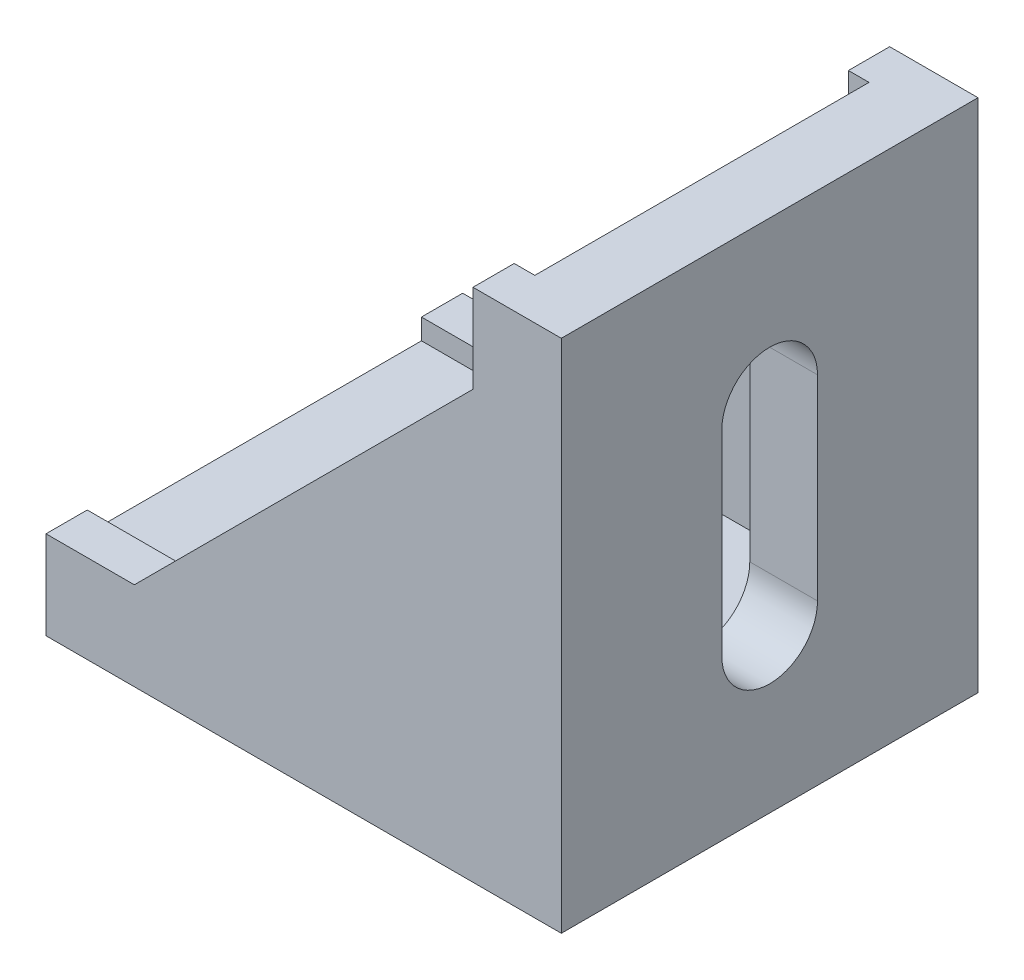
ISO-10303-21;
HEADER;
FILE_DESCRIPTION(('STEP AP214'),'2;1');
FILE_NAME('part.step','',(''),(''),'','','');
FILE_SCHEMA(('AUTOMOTIVE_DESIGN { 1 0 10303 214 1 1 1 1 }'));
ENDSEC;
DATA;
#1=APPLICATION_CONTEXT('core data for automotive mechanical design processes');
#2=APPLICATION_PROTOCOL_DEFINITION('international standard','automotive_design',2000,#1);
#3=PRODUCT_CONTEXT('',#1,'mechanical');
#4=PRODUCT('Part','Part','',(#3));
#5=PRODUCT_RELATED_PRODUCT_CATEGORY('part','',(#4));
#6=PRODUCT_DEFINITION_FORMATION('','',#4);
#7=PRODUCT_DEFINITION_CONTEXT('part definition',#1,'design');
#8=PRODUCT_DEFINITION('design','',#6,#7);
#9=PRODUCT_DEFINITION_SHAPE('','',#8);
#10=(LENGTH_UNIT() NAMED_UNIT(*) SI_UNIT(.MILLI.,.METRE.));
#11=(NAMED_UNIT(*) PLANE_ANGLE_UNIT() SI_UNIT($,.RADIAN.));
#12=(NAMED_UNIT(*) SI_UNIT($,.STERADIAN.) SOLID_ANGLE_UNIT());
#13=UNCERTAINTY_MEASURE_WITH_UNIT(LENGTH_MEASURE(1.E-05),#10,'distance_accuracy_value','');
#14=(GEOMETRIC_REPRESENTATION_CONTEXT(3) GLOBAL_UNCERTAINTY_ASSIGNED_CONTEXT((#13)) GLOBAL_UNIT_ASSIGNED_CONTEXT((#10,
#11,#12)) REPRESENTATION_CONTEXT('',''));
#15=CARTESIAN_POINT('',(0.,0.,0.));
#16=DIRECTION('',(0.,0.,1.));
#17=DIRECTION('',(1.,0.,0.));
#18=AXIS2_PLACEMENT_3D('',#15,#16,#17);
#19=CARTESIAN_POINT('',(35.,0.,14.15));
#20=DIRECTION('',(-1.,0.,0.));
#21=DIRECTION('',(0.,0.,1.));
#22=AXIS2_PLACEMENT_3D('',#19,#20,#21);
#23=PLANE('',#22);
#24=DIRECTION('',(0.,1.,0.));
#25=VECTOR('',#24,1.);
#26=CARTESIAN_POINT('',(35.,0.,-14.15));
#27=LINE('',#26,#25);
#28=CARTESIAN_POINT('',(35.,0.,-14.15));
#29=VERTEX_POINT('',#28);
#30=CARTESIAN_POINT('',(35.,35.,-14.15));
#31=VERTEX_POINT('',#30);
#32=EDGE_CURVE('E311',#29,#31,#27,.T.);
#33=ORIENTED_EDGE('',*,*,#32,.T.);
#34=DIRECTION('',(0.,0.,-1.));
#35=VECTOR('',#34,1.);
#36=CARTESIAN_POINT('',(35.,35.,14.15));
#37=LINE('',#36,#35);
#38=CARTESIAN_POINT('',(35.,35.,14.15));
#39=VERTEX_POINT('',#38);
#40=EDGE_CURVE('E339',#39,#31,#37,.T.);
#41=ORIENTED_EDGE('',*,*,#40,.F.);
#42=DIRECTION('',(0.,1.,0.));
#43=VECTOR('',#42,1.);
#44=CARTESIAN_POINT('',(35.,0.,14.15));
#45=LINE('',#44,#43);
#46=CARTESIAN_POINT('',(35.,0.,14.15));
#47=VERTEX_POINT('',#46);
#48=EDGE_CURVE('E296',#47,#39,#45,.T.);
#49=ORIENTED_EDGE('',*,*,#48,.F.);
#50=DIRECTION('',(0.,0.,-1.));
#51=VECTOR('',#50,1.);
#52=CARTESIAN_POINT('',(35.,0.,14.15));
#53=LINE('',#52,#51);
#54=EDGE_CURVE('E342',#47,#29,#53,.T.);
#55=ORIENTED_EDGE('',*,*,#54,.T.);
#56=EDGE_LOOP('',(#33,#41,#49,#55));
#57=FACE_BOUND('',#56,.T.);
#58=CARTESIAN_POINT('',(35.,10.85,0.));
#59=DIRECTION('',(-1.,0.,0.));
#60=DIRECTION('',(0.,0.,1.));
#61=AXIS2_PLACEMENT_3D('',#58,#59,#60);
#62=CIRCLE('',#61,3.25);
#63=CARTESIAN_POINT('',(35.,10.85,-3.25));
#64=VERTEX_POINT('',#63);
#65=CARTESIAN_POINT('',(35.,10.85,3.25));
#66=VERTEX_POINT('',#65);
#67=EDGE_CURVE('E213',#64,#66,#62,.T.);
#68=ORIENTED_EDGE('',*,*,#67,.T.);
#69=DIRECTION('',(0.,1.,0.));
#70=VECTOR('',#69,1.);
#71=CARTESIAN_POINT('',(35.,10.85,3.25));
#72=LINE('',#71,#70);
#73=CARTESIAN_POINT('',(35.,24.15,3.25));
#74=VERTEX_POINT('',#73);
#75=EDGE_CURVE('E199',#66,#74,#72,.T.);
#76=ORIENTED_EDGE('',*,*,#75,.T.);
#77=CARTESIAN_POINT('',(35.,24.15,0.));
#78=DIRECTION('',(-1.,0.,0.));
#79=DIRECTION('',(0.,0.,1.));
#80=AXIS2_PLACEMENT_3D('',#77,#78,#79);
#81=CIRCLE('',#80,3.25);
#82=CARTESIAN_POINT('',(35.,24.15,-3.25));
#83=VERTEX_POINT('',#82);
#84=EDGE_CURVE('E190',#74,#83,#81,.T.);
#85=ORIENTED_EDGE('',*,*,#84,.T.);
#86=DIRECTION('',(0.,-1.,0.));
#87=VECTOR('',#86,1.);
#88=CARTESIAN_POINT('',(35.,10.85,-3.25));
#89=LINE('',#88,#87);
#90=EDGE_CURVE('E210',#83,#64,#89,.T.);
#91=ORIENTED_EDGE('',*,*,#90,.T.);
#92=EDGE_LOOP('',(#68,#76,#85,#91));
#93=FACE_BOUND('',#92,.T.);
#94=ADVANCED_FACE('F35',(#57,#93),#23,.F.);
#95=CARTESIAN_POINT('',(30.4,4.59999999999999,11.35));
#96=DIRECTION('',(-1.,0.,0.));
#97=DIRECTION('',(0.,0.,1.));
#98=AXIS2_PLACEMENT_3D('',#95,#96,#97);
#99=PLANE('',#98);
#100=DIRECTION('',(0.,1.,0.));
#101=VECTOR('',#100,1.);
#102=CARTESIAN_POINT('',(30.4,4.59999999999999,-11.35));
#103=LINE('',#102,#101);
#104=CARTESIAN_POINT('',(30.4,4.59999999999999,-11.35));
#105=VERTEX_POINT('',#104);
#106=CARTESIAN_POINT('',(30.4,35.,-11.35));
#107=VERTEX_POINT('',#106);
#108=EDGE_CURVE('E268',#105,#107,#103,.T.);
#109=ORIENTED_EDGE('',*,*,#108,.F.);
#110=DIRECTION('',(0.,0.,-1.));
#111=VECTOR('',#110,1.);
#112=CARTESIAN_POINT('',(30.4,4.59999999999999,11.35));
#113=LINE('',#112,#111);
#114=CARTESIAN_POINT('',(30.4,4.59999999999999,11.35));
#115=VERTEX_POINT('',#114);
#116=EDGE_CURVE('E273',#115,#105,#113,.T.);
#117=ORIENTED_EDGE('',*,*,#116,.F.);
#118=DIRECTION('',(0.,1.,0.));
#119=VECTOR('',#118,1.);
#120=CARTESIAN_POINT('',(30.4,4.59999999999999,11.35));
#121=LINE('',#120,#119);
#122=CARTESIAN_POINT('',(30.4,35.,11.35));
#123=VERTEX_POINT('',#122);
#124=EDGE_CURVE('E259',#115,#123,#121,.T.);
#125=ORIENTED_EDGE('',*,*,#124,.T.);
#126=DIRECTION('',(0.,0.,-1.));
#127=VECTOR('',#126,1.);
#128=CARTESIAN_POINT('',(30.4,35.,11.35));
#129=LINE('',#128,#127);
#130=EDGE_CURVE('E264',#123,#107,#129,.T.);
#131=ORIENTED_EDGE('',*,*,#130,.T.);
#132=EDGE_LOOP('',(#109,#117,#125,#131));
#133=FACE_BOUND('',#132,.T.);
#134=DIRECTION('',(0.,1.,0.));
#135=VECTOR('',#134,1.);
#136=CARTESIAN_POINT('',(30.4,10.85,3.25));
#137=LINE('',#136,#135);
#138=CARTESIAN_POINT('',(30.4,10.85,3.25));
#139=VERTEX_POINT('',#138);
#140=CARTESIAN_POINT('',(30.4,24.15,3.25));
#141=VERTEX_POINT('',#140);
#142=EDGE_CURVE('E196',#139,#141,#137,.T.);
#143=ORIENTED_EDGE('',*,*,#142,.F.);
#144=CARTESIAN_POINT('',(30.4,10.85,0.));
#145=DIRECTION('',(-1.,0.,0.));
#146=DIRECTION('',(0.,0.,1.));
#147=AXIS2_PLACEMENT_3D('',#144,#145,#146);
#148=CIRCLE('',#147,3.25);
#149=CARTESIAN_POINT('',(30.4,10.85,-3.25));
#150=VERTEX_POINT('',#149);
#151=EDGE_CURVE('E58',#150,#139,#148,.T.);
#152=ORIENTED_EDGE('',*,*,#151,.F.);
#153=DIRECTION('',(0.,-1.,0.));
#154=VECTOR('',#153,1.);
#155=CARTESIAN_POINT('',(30.4,10.85,-3.25));
#156=LINE('',#155,#154);
#157=CARTESIAN_POINT('',(30.4,24.15,-3.25));
#158=VERTEX_POINT('',#157);
#159=EDGE_CURVE('E204',#158,#150,#156,.T.);
#160=ORIENTED_EDGE('',*,*,#159,.F.);
#161=CARTESIAN_POINT('',(30.4,24.15,0.));
#162=DIRECTION('',(-1.,0.,0.));
#163=DIRECTION('',(0.,0.,1.));
#164=AXIS2_PLACEMENT_3D('',#161,#162,#163);
#165=CIRCLE('',#164,3.25);
#166=EDGE_CURVE('E187',#141,#158,#165,.T.);
#167=ORIENTED_EDGE('',*,*,#166,.F.);
#168=EDGE_LOOP('',(#143,#152,#160,#167));
#169=FACE_BOUND('',#168,.T.);
#170=ADVANCED_FACE('F202',(#133,#169),#99,.T.);
#171=CARTESIAN_POINT('',(0.,0.,14.15));
#172=DIRECTION('',(0.,1.,0.));
#173=DIRECTION('',(0.,0.,1.));
#174=AXIS2_PLACEMENT_3D('',#171,#172,#173);
#175=PLANE('',#174);
#176=DIRECTION('',(1.,0.,0.));
#177=VECTOR('',#176,1.);
#178=CARTESIAN_POINT('',(0.,0.,-14.15));
#179=LINE('',#178,#177);
#180=CARTESIAN_POINT('',(0.,0.,-14.15));
#181=VERTEX_POINT('',#180);
#182=EDGE_CURVE('E309',#181,#29,#179,.T.);
#183=ORIENTED_EDGE('',*,*,#182,.T.);
#184=ORIENTED_EDGE('',*,*,#54,.F.);
#185=DIRECTION('',(1.,0.,0.));
#186=VECTOR('',#185,1.);
#187=CARTESIAN_POINT('',(0.,0.,14.15));
#188=LINE('',#187,#186);
#189=CARTESIAN_POINT('',(0.,0.,14.15));
#190=VERTEX_POINT('',#189);
#191=EDGE_CURVE('E293',#190,#47,#188,.T.);
#192=ORIENTED_EDGE('',*,*,#191,.F.);
#193=DIRECTION('',(0.,0.,-1.));
#194=VECTOR('',#193,1.);
#195=CARTESIAN_POINT('',(0.,0.,14.15));
#196=LINE('',#195,#194);
#197=EDGE_CURVE('E345',#190,#181,#196,.T.);
#198=ORIENTED_EDGE('',*,*,#197,.T.);
#199=EDGE_LOOP('',(#183,#184,#192,#198));
#200=FACE_BOUND('',#199,.T.);
#201=CARTESIAN_POINT('',(10.85,0.,0.));
#202=DIRECTION('',(0.,1.,0.));
#203=DIRECTION('',(0.,0.,1.));
#204=AXIS2_PLACEMENT_3D('',#201,#202,#203);
#205=CIRCLE('',#204,3.25);
#206=CARTESIAN_POINT('',(10.85,0.,-3.25));
#207=VERTEX_POINT('',#206);
#208=CARTESIAN_POINT('',(10.85,0.,3.25));
#209=VERTEX_POINT('',#208);
#210=EDGE_CURVE('E228',#207,#209,#205,.T.);
#211=ORIENTED_EDGE('',*,*,#210,.T.);
#212=DIRECTION('',(1.,0.,0.));
#213=VECTOR('',#212,1.);
#214=CARTESIAN_POINT('',(10.85,0.,3.25));
#215=LINE('',#214,#213);
#216=CARTESIAN_POINT('',(24.15,0.,3.25));
#217=VERTEX_POINT('',#216);
#218=EDGE_CURVE('E231',#209,#217,#215,.T.);
#219=ORIENTED_EDGE('',*,*,#218,.T.);
#220=CARTESIAN_POINT('',(24.15,0.,0.));
#221=DIRECTION('',(0.,1.,0.));
#222=DIRECTION('',(0.,0.,1.));
#223=AXIS2_PLACEMENT_3D('',#220,#221,#222);
#224=CIRCLE('',#223,3.25);
#225=CARTESIAN_POINT('',(24.15,0.,-3.25));
#226=VERTEX_POINT('',#225);
#227=EDGE_CURVE('E234',#217,#226,#224,.T.);
#228=ORIENTED_EDGE('',*,*,#227,.T.);
#229=DIRECTION('',(-1.,0.,0.));
#230=VECTOR('',#229,1.);
#231=CARTESIAN_POINT('',(10.85,0.,-3.25));
#232=LINE('',#231,#230);
#233=EDGE_CURVE('E237',#226,#207,#232,.T.);
#234=ORIENTED_EDGE('',*,*,#233,.T.);
#235=EDGE_LOOP('',(#211,#219,#228,#234));
#236=FACE_BOUND('',#235,.T.);
#237=ADVANCED_FACE('F368',(#200,#236),#175,.F.);
#238=CARTESIAN_POINT('',(0.,4.59999999999999,11.35));
#239=DIRECTION('',(0.,1.,0.));
#240=DIRECTION('',(0.,0.,1.));
#241=AXIS2_PLACEMENT_3D('',#238,#239,#240);
#242=PLANE('',#241);
#243=DIRECTION('',(1.,0.,0.));
#244=VECTOR('',#243,1.);
#245=CARTESIAN_POINT('',(0.,4.59999999999999,-11.35));
#246=LINE('',#245,#244);
#247=CARTESIAN_POINT('',(0.,4.59999999999999,-11.35));
#248=VERTEX_POINT('',#247);
#249=EDGE_CURVE('E266',#248,#105,#246,.T.);
#250=ORIENTED_EDGE('',*,*,#249,.F.);
#251=DIRECTION('',(0.,0.,-1.));
#252=VECTOR('',#251,1.);
#253=CARTESIAN_POINT('',(0.,4.59999999999999,11.35));
#254=LINE('',#253,#252);
#255=CARTESIAN_POINT('',(0.,4.59999999999999,11.35));
#256=VERTEX_POINT('',#255);
#257=EDGE_CURVE('E276',#256,#248,#254,.T.);
#258=ORIENTED_EDGE('',*,*,#257,.F.);
#259=DIRECTION('',(1.,0.,0.));
#260=VECTOR('',#259,1.);
#261=CARTESIAN_POINT('',(0.,4.59999999999999,11.35));
#262=LINE('',#261,#260);
#263=EDGE_CURVE('E256',#256,#115,#262,.T.);
#264=ORIENTED_EDGE('',*,*,#263,.T.);
#265=ORIENTED_EDGE('',*,*,#116,.T.);
#266=EDGE_LOOP('',(#250,#258,#264,#265));
#267=FACE_BOUND('',#266,.T.);
#268=DIRECTION('',(1.,0.,0.));
#269=VECTOR('',#268,1.);
#270=CARTESIAN_POINT('',(10.85,4.59999999999999,3.25));
#271=LINE('',#270,#269);
#272=CARTESIAN_POINT('',(10.85,4.59999999999999,3.25));
#273=VERTEX_POINT('',#272);
#274=CARTESIAN_POINT('',(24.15,4.59999999999999,3.25));
#275=VERTEX_POINT('',#274);
#276=EDGE_CURVE('E222',#273,#275,#271,.T.);
#277=ORIENTED_EDGE('',*,*,#276,.F.);
#278=CARTESIAN_POINT('',(10.85,4.59999999999999,0.));
#279=DIRECTION('',(0.,1.,0.));
#280=DIRECTION('',(0.,0.,1.));
#281=AXIS2_PLACEMENT_3D('',#278,#279,#280);
#282=CIRCLE('',#281,3.25);
#283=CARTESIAN_POINT('',(10.85,4.59999999999999,-3.25));
#284=VERTEX_POINT('',#283);
#285=EDGE_CURVE('E225',#284,#273,#282,.T.);
#286=ORIENTED_EDGE('',*,*,#285,.F.);
#287=DIRECTION('',(-1.,0.,0.));
#288=VECTOR('',#287,1.);
#289=CARTESIAN_POINT('',(10.85,4.59999999999999,-3.25));
#290=LINE('',#289,#288);
#291=CARTESIAN_POINT('',(24.15,4.59999999999999,-3.25));
#292=VERTEX_POINT('',#291);
#293=EDGE_CURVE('E249',#292,#284,#290,.T.);
#294=ORIENTED_EDGE('',*,*,#293,.F.);
#295=CARTESIAN_POINT('',(24.15,4.59999999999999,0.));
#296=DIRECTION('',(0.,1.,0.));
#297=DIRECTION('',(0.,0.,1.));
#298=AXIS2_PLACEMENT_3D('',#295,#296,#297);
#299=CIRCLE('',#298,3.25);
#300=EDGE_CURVE('E220',#275,#292,#299,.T.);
#301=ORIENTED_EDGE('',*,*,#300,.F.);
#302=EDGE_LOOP('',(#277,#286,#294,#301));
#303=FACE_BOUND('',#302,.T.);
#304=ADVANCED_FACE('F386',(#267,#303),#242,.T.);
#305=CARTESIAN_POINT('',(29.,35.,14.15));
#306=DIRECTION('',(1.,0.,0.));
#307=DIRECTION('',(0.,0.,-1.));
#308=AXIS2_PLACEMENT_3D('',#305,#306,#307);
#309=PLANE('',#308);
#310=DIRECTION('',(0.,-1.,0.));
#311=VECTOR('',#310,1.);
#312=CARTESIAN_POINT('',(29.,35.,-11.35));
#313=LINE('',#312,#311);
#314=CARTESIAN_POINT('',(29.,35.,-11.35));
#315=VERTEX_POINT('',#314);
#316=CARTESIAN_POINT('',(29.,29.,-11.35));
#317=VERTEX_POINT('',#316);
#318=EDGE_CURVE('E281',#315,#317,#313,.T.);
#319=ORIENTED_EDGE('',*,*,#318,.F.);
#320=DIRECTION('',(0.,0.,-1.));
#321=VECTOR('',#320,1.);
#322=CARTESIAN_POINT('',(29.,35.,14.15));
#323=LINE('',#322,#321);
#324=CARTESIAN_POINT('',(29.,35.,-14.15));
#325=VERTEX_POINT('',#324);
#326=EDGE_CURVE('E335',#315,#325,#323,.T.);
#327=ORIENTED_EDGE('',*,*,#326,.T.);
#328=DIRECTION('',(0.,-1.,0.));
#329=VECTOR('',#328,1.);
#330=CARTESIAN_POINT('',(29.,35.,-14.15));
#331=LINE('',#330,#329);
#332=CARTESIAN_POINT('',(29.,29.,-14.15));
#333=VERTEX_POINT('',#332);
#334=EDGE_CURVE('E316',#325,#333,#331,.T.);
#335=ORIENTED_EDGE('',*,*,#334,.T.);
#336=DIRECTION('',(0.,0.,-1.));
#337=VECTOR('',#336,1.);
#338=CARTESIAN_POINT('',(29.,29.,14.15));
#339=LINE('',#338,#337);
#340=EDGE_CURVE('E331',#317,#333,#339,.T.);
#341=ORIENTED_EDGE('',*,*,#340,.F.);
#342=EDGE_LOOP('',(#319,#327,#335,#341));
#343=FACE_BOUND('',#342,.T.);
#344=ADVANCED_FACE('F399',(#343),#309,.F.);
#345=CARTESIAN_POINT('',(29.,29.,14.15));
#346=DIRECTION('',(0.707106781186547,-0.707106781186547,0.));
#347=DIRECTION('',(0.707106781186548,0.707106781186548,0.));
#348=AXIS2_PLACEMENT_3D('',#345,#346,#347);
#349=PLANE('',#348);
#350=DIRECTION('',(-0.707106781186548,-0.707106781186548,0.));
#351=VECTOR('',#350,1.);
#352=CARTESIAN_POINT('',(29.,29.,-11.35));
#353=LINE('',#352,#351);
#354=CARTESIAN_POINT('',(6.,6.,-11.35));
#355=VERTEX_POINT('',#354);
#356=EDGE_CURVE('E279',#317,#355,#353,.T.);
#357=ORIENTED_EDGE('',*,*,#356,.F.);
#358=ORIENTED_EDGE('',*,*,#340,.T.);
#359=DIRECTION('',(-0.707106781186548,-0.707106781186548,0.));
#360=VECTOR('',#359,1.);
#361=CARTESIAN_POINT('',(29.,29.,-14.15));
#362=LINE('',#361,#360);
#363=CARTESIAN_POINT('',(6.,6.,-14.15));
#364=VERTEX_POINT('',#363);
#365=EDGE_CURVE('E319',#333,#364,#362,.T.);
#366=ORIENTED_EDGE('',*,*,#365,.T.);
#367=DIRECTION('',(0.,0.,-1.));
#368=VECTOR('',#367,1.);
#369=CARTESIAN_POINT('',(6.,6.,14.15));
#370=LINE('',#369,#368);
#371=EDGE_CURVE('E327',#355,#364,#370,.T.);
#372=ORIENTED_EDGE('',*,*,#371,.F.);
#373=EDGE_LOOP('',(#357,#358,#366,#372));
#374=FACE_BOUND('',#373,.T.);
#375=ADVANCED_FACE('F402',(#374),#349,.F.);
#376=CARTESIAN_POINT('',(6.,6.,14.15));
#377=DIRECTION('',(0.,-1.,0.));
#378=DIRECTION('',(1.,0.,0.));
#379=AXIS2_PLACEMENT_3D('',#376,#377,#378);
#380=PLANE('',#379);
#381=DIRECTION('',(-1.,0.,0.));
#382=VECTOR('',#381,1.);
#383=CARTESIAN_POINT('',(6.,6.,-11.35));
#384=LINE('',#383,#382);
#385=CARTESIAN_POINT('',(0.,6.,-11.35));
#386=VERTEX_POINT('',#385);
#387=EDGE_CURVE('E43',#355,#386,#384,.T.);
#388=ORIENTED_EDGE('',*,*,#387,.F.);
#389=ORIENTED_EDGE('',*,*,#371,.T.);
#390=DIRECTION('',(-1.,0.,0.));
#391=VECTOR('',#390,1.);
#392=CARTESIAN_POINT('',(6.,6.,-14.15));
#393=LINE('',#392,#391);
#394=CARTESIAN_POINT('',(0.,6.,-14.15));
#395=VERTEX_POINT('',#394);
#396=EDGE_CURVE('E294',#364,#395,#393,.T.);
#397=ORIENTED_EDGE('',*,*,#396,.T.);
#398=DIRECTION('',(0.,0.,-1.));
#399=VECTOR('',#398,1.);
#400=CARTESIAN_POINT('',(0.,6.,14.15));
#401=LINE('',#400,#399);
#402=EDGE_CURVE('E306',#386,#395,#401,.T.);
#403=ORIENTED_EDGE('',*,*,#402,.F.);
#404=EDGE_LOOP('',(#388,#389,#397,#403));
#405=FACE_BOUND('',#404,.T.);
#406=ADVANCED_FACE('F358',(#405),#380,.F.);
#407=CARTESIAN_POINT('',(0.,6.,14.15));
#408=DIRECTION('',(1.,0.,0.));
#409=DIRECTION('',(0.,1.,0.));
#410=AXIS2_PLACEMENT_3D('',#407,#408,#409);
#411=PLANE('',#410);
#412=CARTESIAN_POINT('',(0.,6.,14.15));
#413=VERTEX_POINT('',#412);
#414=CARTESIAN_POINT('',(0.,6.,11.35));
#415=VERTEX_POINT('',#414);
#416=EDGE_CURVE('E324',#413,#415,#401,.T.);
#417=ORIENTED_EDGE('',*,*,#416,.T.);
#418=DIRECTION('',(0.,-1.,0.));
#419=VECTOR('',#418,1.);
#420=CARTESIAN_POINT('',(0.,35.,11.35));
#421=LINE('',#420,#419);
#422=EDGE_CURVE('E253',#415,#256,#421,.T.);
#423=ORIENTED_EDGE('',*,*,#422,.T.);
#424=ORIENTED_EDGE('',*,*,#257,.T.);
#425=DIRECTION('',(0.,-1.,0.));
#426=VECTOR('',#425,1.);
#427=CARTESIAN_POINT('',(0.,35.,-11.35));
#428=LINE('',#427,#426);
#429=EDGE_CURVE('E252',#386,#248,#428,.T.);
#430=ORIENTED_EDGE('',*,*,#429,.F.);
#431=ORIENTED_EDGE('',*,*,#402,.T.);
#432=DIRECTION('',(0.,-1.,0.));
#433=VECTOR('',#432,1.);
#434=CARTESIAN_POINT('',(0.,6.,-14.15));
#435=LINE('',#434,#433);
#436=EDGE_CURVE('E289',#395,#181,#435,.T.);
#437=ORIENTED_EDGE('',*,*,#436,.T.);
#438=ORIENTED_EDGE('',*,*,#197,.F.);
#439=DIRECTION('',(0.,-1.,0.));
#440=VECTOR('',#439,1.);
#441=CARTESIAN_POINT('',(0.,6.,14.15));
#442=LINE('',#441,#440);
#443=EDGE_CURVE('E290',#413,#190,#442,.T.);
#444=ORIENTED_EDGE('',*,*,#443,.F.);
#445=EDGE_LOOP('',(#417,#423,#424,#430,#431,#437,#438,#444));
#446=FACE_BOUND('',#445,.T.);
#447=ADVANCED_FACE('F37',(#446),#411,.F.);
#448=CARTESIAN_POINT('',(35.,35.,14.15));
#449=DIRECTION('',(0.,-1.,0.));
#450=DIRECTION('',(0.,0.,-1.));
#451=AXIS2_PLACEMENT_3D('',#448,#449,#450);
#452=PLANE('',#451);
#453=ORIENTED_EDGE('',*,*,#130,.F.);
#454=DIRECTION('',(-1.,0.,0.));
#455=VECTOR('',#454,1.);
#456=CARTESIAN_POINT('',(30.4,35.,11.35));
#457=LINE('',#456,#455);
#458=CARTESIAN_POINT('',(29.,35.,11.35));
#459=VERTEX_POINT('',#458);
#460=EDGE_CURVE('E261',#123,#459,#457,.T.);
#461=ORIENTED_EDGE('',*,*,#460,.T.);
#462=CARTESIAN_POINT('',(29.,35.,14.15));
#463=VERTEX_POINT('',#462);
#464=EDGE_CURVE('E336',#463,#459,#323,.T.);
#465=ORIENTED_EDGE('',*,*,#464,.F.);
#466=DIRECTION('',(-1.,0.,0.));
#467=VECTOR('',#466,1.);
#468=CARTESIAN_POINT('',(35.,35.,14.15));
#469=LINE('',#468,#467);
#470=EDGE_CURVE('E298',#39,#463,#469,.T.);
#471=ORIENTED_EDGE('',*,*,#470,.F.);
#472=ORIENTED_EDGE('',*,*,#40,.T.);
#473=DIRECTION('',(-1.,0.,0.));
#474=VECTOR('',#473,1.);
#475=CARTESIAN_POINT('',(35.,35.,-14.15));
#476=LINE('',#475,#474);
#477=EDGE_CURVE('E313',#31,#325,#476,.T.);
#478=ORIENTED_EDGE('',*,*,#477,.T.);
#479=ORIENTED_EDGE('',*,*,#326,.F.);
#480=DIRECTION('',(-1.,0.,0.));
#481=VECTOR('',#480,1.);
#482=CARTESIAN_POINT('',(30.4,35.,-11.35));
#483=LINE('',#482,#481);
#484=EDGE_CURVE('E257',#107,#315,#483,.T.);
#485=ORIENTED_EDGE('',*,*,#484,.F.);
#486=EDGE_LOOP('',(#453,#461,#465,#471,#472,#478,#479,#485));
#487=FACE_BOUND('',#486,.T.);
#488=ADVANCED_FACE('F395',(#487),#452,.F.);
#489=ORIENTED_EDGE('',*,*,#464,.T.);
#490=DIRECTION('',(0.,-1.,0.));
#491=VECTOR('',#490,1.);
#492=CARTESIAN_POINT('',(29.,35.,11.35));
#493=LINE('',#492,#491);
#494=CARTESIAN_POINT('',(29.,29.,11.35));
#495=VERTEX_POINT('',#494);
#496=EDGE_CURVE('E286',#459,#495,#493,.T.);
#497=ORIENTED_EDGE('',*,*,#496,.T.);
#498=CARTESIAN_POINT('',(29.,29.,14.15));
#499=VERTEX_POINT('',#498);
#500=EDGE_CURVE('E332',#499,#495,#339,.T.);
#501=ORIENTED_EDGE('',*,*,#500,.F.);
#502=DIRECTION('',(0.,-1.,0.));
#503=VECTOR('',#502,1.);
#504=CARTESIAN_POINT('',(29.,35.,14.15));
#505=LINE('',#504,#503);
#506=EDGE_CURVE('E300',#463,#499,#505,.T.);
#507=ORIENTED_EDGE('',*,*,#506,.F.);
#508=EDGE_LOOP('',(#489,#497,#501,#507));
#509=FACE_BOUND('',#508,.T.);
#510=ADVANCED_FACE('F411',(#509),#309,.F.);
#511=ORIENTED_EDGE('',*,*,#500,.T.);
#512=DIRECTION('',(-0.707106781186548,-0.707106781186548,0.));
#513=VECTOR('',#512,1.);
#514=CARTESIAN_POINT('',(29.,29.,11.35));
#515=LINE('',#514,#513);
#516=CARTESIAN_POINT('',(6.,6.,11.35));
#517=VERTEX_POINT('',#516);
#518=EDGE_CURVE('E283',#495,#517,#515,.T.);
#519=ORIENTED_EDGE('',*,*,#518,.T.);
#520=CARTESIAN_POINT('',(6.,6.,14.15));
#521=VERTEX_POINT('',#520);
#522=EDGE_CURVE('E328',#521,#517,#370,.T.);
#523=ORIENTED_EDGE('',*,*,#522,.F.);
#524=DIRECTION('',(-0.707106781186548,-0.707106781186548,0.));
#525=VECTOR('',#524,1.);
#526=CARTESIAN_POINT('',(29.,29.,14.15));
#527=LINE('',#526,#525);
#528=EDGE_CURVE('E302',#499,#521,#527,.T.);
#529=ORIENTED_EDGE('',*,*,#528,.F.);
#530=EDGE_LOOP('',(#511,#519,#523,#529));
#531=FACE_BOUND('',#530,.T.);
#532=ADVANCED_FACE('F413',(#531),#349,.F.);
#533=ORIENTED_EDGE('',*,*,#522,.T.);
#534=DIRECTION('',(-1.,0.,0.));
#535=VECTOR('',#534,1.);
#536=CARTESIAN_POINT('',(6.,6.,11.35));
#537=LINE('',#536,#535);
#538=EDGE_CURVE('E11',#517,#415,#537,.T.);
#539=ORIENTED_EDGE('',*,*,#538,.T.);
#540=ORIENTED_EDGE('',*,*,#416,.F.);
#541=DIRECTION('',(-1.,0.,0.));
#542=VECTOR('',#541,1.);
#543=CARTESIAN_POINT('',(6.,6.,14.15));
#544=LINE('',#543,#542);
#545=EDGE_CURVE('E304',#521,#413,#544,.T.);
#546=ORIENTED_EDGE('',*,*,#545,.F.);
#547=EDGE_LOOP('',(#533,#539,#540,#546));
#548=FACE_BOUND('',#547,.T.);
#549=ADVANCED_FACE('F379',(#548),#380,.F.);
#550=CARTESIAN_POINT('',(0.,0.,14.15));
#551=DIRECTION('',(0.,0.,1.));
#552=DIRECTION('',(1.,0.,0.));
#553=AXIS2_PLACEMENT_3D('',#550,#551,#552);
#554=PLANE('',#553);
#555=ORIENTED_EDGE('',*,*,#443,.T.);
#556=ORIENTED_EDGE('',*,*,#191,.T.);
#557=ORIENTED_EDGE('',*,*,#48,.T.);
#558=ORIENTED_EDGE('',*,*,#470,.T.);
#559=ORIENTED_EDGE('',*,*,#506,.T.);
#560=ORIENTED_EDGE('',*,*,#528,.T.);
#561=ORIENTED_EDGE('',*,*,#545,.T.);
#562=EDGE_LOOP('',(#555,#556,#557,#558,#559,#560,#561));
#563=FACE_BOUND('',#562,.T.);
#564=ADVANCED_FACE('F373',(#563),#554,.T.);
#565=CARTESIAN_POINT('',(0.,0.,-14.15));
#566=DIRECTION('',(0.,0.,1.));
#567=DIRECTION('',(1.,0.,0.));
#568=AXIS2_PLACEMENT_3D('',#565,#566,#567);
#569=PLANE('',#568);
#570=ORIENTED_EDGE('',*,*,#436,.F.);
#571=ORIENTED_EDGE('',*,*,#396,.F.);
#572=ORIENTED_EDGE('',*,*,#365,.F.);
#573=ORIENTED_EDGE('',*,*,#334,.F.);
#574=ORIENTED_EDGE('',*,*,#477,.F.);
#575=ORIENTED_EDGE('',*,*,#32,.F.);
#576=ORIENTED_EDGE('',*,*,#182,.F.);
#577=EDGE_LOOP('',(#570,#571,#572,#573,#574,#575,#576));
#578=FACE_BOUND('',#577,.T.);
#579=ADVANCED_FACE('F363',(#578),#569,.F.);
#580=CARTESIAN_POINT('',(0.,0.,11.35));
#581=DIRECTION('',(0.,0.,1.));
#582=DIRECTION('',(1.,0.,0.));
#583=AXIS2_PLACEMENT_3D('',#580,#581,#582);
#584=PLANE('',#583);
#585=ORIENTED_EDGE('',*,*,#460,.F.);
#586=ORIENTED_EDGE('',*,*,#124,.F.);
#587=ORIENTED_EDGE('',*,*,#263,.F.);
#588=ORIENTED_EDGE('',*,*,#422,.F.);
#589=ORIENTED_EDGE('',*,*,#538,.F.);
#590=ORIENTED_EDGE('',*,*,#518,.F.);
#591=ORIENTED_EDGE('',*,*,#496,.F.);
#592=EDGE_LOOP('',(#585,#586,#587,#588,#589,#590,#591));
#593=FACE_BOUND('',#592,.T.);
#594=ADVANCED_FACE('F382',(#593),#584,.F.);
#595=CARTESIAN_POINT('',(0.,0.,-11.35));
#596=DIRECTION('',(0.,0.,1.));
#597=DIRECTION('',(1.,0.,0.));
#598=AXIS2_PLACEMENT_3D('',#595,#596,#597);
#599=PLANE('',#598);
#600=ORIENTED_EDGE('',*,*,#318,.T.);
#601=ORIENTED_EDGE('',*,*,#356,.T.);
#602=ORIENTED_EDGE('',*,*,#387,.T.);
#603=ORIENTED_EDGE('',*,*,#429,.T.);
#604=ORIENTED_EDGE('',*,*,#249,.T.);
#605=ORIENTED_EDGE('',*,*,#108,.T.);
#606=ORIENTED_EDGE('',*,*,#484,.T.);
#607=EDGE_LOOP('',(#600,#601,#602,#603,#604,#605,#606));
#608=FACE_BOUND('',#607,.T.);
#609=ADVANCED_FACE('F350',(#608),#599,.T.);
#610=CARTESIAN_POINT('',(10.85,35.001,0.));
#611=DIRECTION('',(0.,-1.,0.));
#612=DIRECTION('',(0.,0.,-1.));
#613=AXIS2_PLACEMENT_3D('',#610,#611,#612);
#614=CYLINDRICAL_SURFACE('',#613,3.25);
#615=ORIENTED_EDGE('',*,*,#285,.T.);
#616=DIRECTION('',(0.,-1.,0.));
#617=VECTOR('',#616,1.);
#618=CARTESIAN_POINT('',(10.85,35.001,3.25));
#619=LINE('',#618,#617);
#620=EDGE_CURVE('E247',#273,#209,#619,.T.);
#621=ORIENTED_EDGE('',*,*,#620,.T.);
#622=ORIENTED_EDGE('',*,*,#210,.F.);
#623=DIRECTION('',(0.,-1.,0.));
#624=VECTOR('',#623,1.);
#625=CARTESIAN_POINT('',(10.85,35.001,-3.25));
#626=LINE('',#625,#624);
#627=EDGE_CURVE('E240',#284,#207,#626,.T.);
#628=ORIENTED_EDGE('',*,*,#627,.F.);
#629=EDGE_LOOP('',(#615,#621,#622,#628));
#630=FACE_BOUND('',#629,.T.);
#631=ADVANCED_FACE('F450',(#630),#614,.F.);
#632=CARTESIAN_POINT('',(10.85,35.001,3.25));
#633=DIRECTION('',(0.,0.,-1.));
#634=DIRECTION('',(-1.,0.,0.));
#635=AXIS2_PLACEMENT_3D('',#632,#633,#634);
#636=PLANE('',#635);
#637=ORIENTED_EDGE('',*,*,#276,.T.);
#638=DIRECTION('',(0.,-1.,0.));
#639=VECTOR('',#638,1.);
#640=CARTESIAN_POINT('',(24.15,35.001,3.25));
#641=LINE('',#640,#639);
#642=EDGE_CURVE('E245',#275,#217,#641,.T.);
#643=ORIENTED_EDGE('',*,*,#642,.T.);
#644=ORIENTED_EDGE('',*,*,#218,.F.);
#645=ORIENTED_EDGE('',*,*,#620,.F.);
#646=EDGE_LOOP('',(#637,#643,#644,#645));
#647=FACE_BOUND('',#646,.T.);
#648=ADVANCED_FACE('F454',(#647),#636,.T.);
#649=CARTESIAN_POINT('',(24.15,35.001,0.));
#650=DIRECTION('',(0.,-1.,0.));
#651=DIRECTION('',(0.,0.,-1.));
#652=AXIS2_PLACEMENT_3D('',#649,#650,#651);
#653=CYLINDRICAL_SURFACE('',#652,3.25);
#654=ORIENTED_EDGE('',*,*,#300,.T.);
#655=DIRECTION('',(0.,-1.,0.));
#656=VECTOR('',#655,1.);
#657=CARTESIAN_POINT('',(24.15,35.001,-3.25));
#658=LINE('',#657,#656);
#659=EDGE_CURVE('E243',#292,#226,#658,.T.);
#660=ORIENTED_EDGE('',*,*,#659,.T.);
#661=ORIENTED_EDGE('',*,*,#227,.F.);
#662=ORIENTED_EDGE('',*,*,#642,.F.);
#663=EDGE_LOOP('',(#654,#660,#661,#662));
#664=FACE_BOUND('',#663,.T.);
#665=ADVANCED_FACE('F458',(#664),#653,.F.);
#666=CARTESIAN_POINT('',(10.85,35.001,-3.25));
#667=DIRECTION('',(0.,0.,1.));
#668=DIRECTION('',(1.,0.,0.));
#669=AXIS2_PLACEMENT_3D('',#666,#667,#668);
#670=PLANE('',#669);
#671=ORIENTED_EDGE('',*,*,#293,.T.);
#672=ORIENTED_EDGE('',*,*,#627,.T.);
#673=ORIENTED_EDGE('',*,*,#233,.F.);
#674=ORIENTED_EDGE('',*,*,#659,.F.);
#675=EDGE_LOOP('',(#671,#672,#673,#674));
#676=FACE_BOUND('',#675,.T.);
#677=ADVANCED_FACE('F462',(#676),#670,.T.);
#678=CARTESIAN_POINT('',(35.001,10.85,0.));
#679=DIRECTION('',(-1.,0.,0.));
#680=DIRECTION('',(0.,0.,1.));
#681=AXIS2_PLACEMENT_3D('',#678,#679,#680);
#682=CYLINDRICAL_SURFACE('',#681,3.25);
#683=DIRECTION('',(-1.,0.,0.));
#684=VECTOR('',#683,1.);
#685=CARTESIAN_POINT('',(35.001,10.85,-3.25));
#686=LINE('',#685,#684);
#687=EDGE_CURVE('E200',#64,#150,#686,.T.);
#688=ORIENTED_EDGE('',*,*,#687,.T.);
#689=ORIENTED_EDGE('',*,*,#151,.T.);
#690=DIRECTION('',(-1.,0.,0.));
#691=VECTOR('',#690,1.);
#692=CARTESIAN_POINT('',(35.001,10.85,3.25));
#693=LINE('',#692,#691);
#694=EDGE_CURVE('E193',#66,#139,#693,.T.);
#695=ORIENTED_EDGE('',*,*,#694,.F.);
#696=ORIENTED_EDGE('',*,*,#67,.F.);
#697=EDGE_LOOP('',(#688,#689,#695,#696));
#698=FACE_BOUND('',#697,.T.);
#699=ADVANCED_FACE('F466',(#698),#682,.F.);
#700=CARTESIAN_POINT('',(35.001,10.85,-3.25));
#701=DIRECTION('',(0.,0.,1.));
#702=DIRECTION('',(0.,-1.,0.));
#703=AXIS2_PLACEMENT_3D('',#700,#701,#702);
#704=PLANE('',#703);
#705=DIRECTION('',(-1.,0.,0.));
#706=VECTOR('',#705,1.);
#707=CARTESIAN_POINT('',(35.001,24.15,-3.25));
#708=LINE('',#707,#706);
#709=EDGE_CURVE('E192',#83,#158,#708,.T.);
#710=ORIENTED_EDGE('',*,*,#709,.T.);
#711=ORIENTED_EDGE('',*,*,#159,.T.);
#712=ORIENTED_EDGE('',*,*,#687,.F.);
#713=ORIENTED_EDGE('',*,*,#90,.F.);
#714=EDGE_LOOP('',(#710,#711,#712,#713));
#715=FACE_BOUND('',#714,.T.);
#716=ADVANCED_FACE('F470',(#715),#704,.T.);
#717=CARTESIAN_POINT('',(35.001,24.15,0.));
#718=DIRECTION('',(-1.,0.,0.));
#719=DIRECTION('',(0.,0.,1.));
#720=AXIS2_PLACEMENT_3D('',#717,#718,#719);
#721=CYLINDRICAL_SURFACE('',#720,3.25);
#722=DIRECTION('',(-1.,0.,0.));
#723=VECTOR('',#722,1.);
#724=CARTESIAN_POINT('',(35.001,24.15,3.25));
#725=LINE('',#724,#723);
#726=EDGE_CURVE('E50',#74,#141,#725,.T.);
#727=ORIENTED_EDGE('',*,*,#726,.T.);
#728=ORIENTED_EDGE('',*,*,#166,.T.);
#729=ORIENTED_EDGE('',*,*,#709,.F.);
#730=ORIENTED_EDGE('',*,*,#84,.F.);
#731=EDGE_LOOP('',(#727,#728,#729,#730));
#732=FACE_BOUND('',#731,.T.);
#733=ADVANCED_FACE('F184',(#732),#721,.F.);
#734=CARTESIAN_POINT('',(35.001,10.85,3.25));
#735=DIRECTION('',(0.,0.,-1.));
#736=DIRECTION('',(0.,1.,0.));
#737=AXIS2_PLACEMENT_3D('',#734,#735,#736);
#738=PLANE('',#737);
#739=ORIENTED_EDGE('',*,*,#694,.T.);
#740=ORIENTED_EDGE('',*,*,#142,.T.);
#741=ORIENTED_EDGE('',*,*,#726,.F.);
#742=ORIENTED_EDGE('',*,*,#75,.F.);
#743=EDGE_LOOP('',(#739,#740,#741,#742));
#744=FACE_BOUND('',#743,.T.);
#745=ADVANCED_FACE('F197',(#744),#738,.T.);
#746=CLOSED_SHELL('',(#94,#170,#237,#304,#344,#375,#406,#447,#488,#510,#532,#549,#564,#579,#594,
#609,#631,#648,#665,#677,#699,#716,#733,#745));
#747=MANIFOLD_SOLID_BREP('B2',#746);
#748=ADVANCED_BREP_SHAPE_REPRESENTATION('',(#18,#747),#14);
#749=SHAPE_DEFINITION_REPRESENTATION(#9,#748);
ENDSEC;
END-ISO-10303-21;
